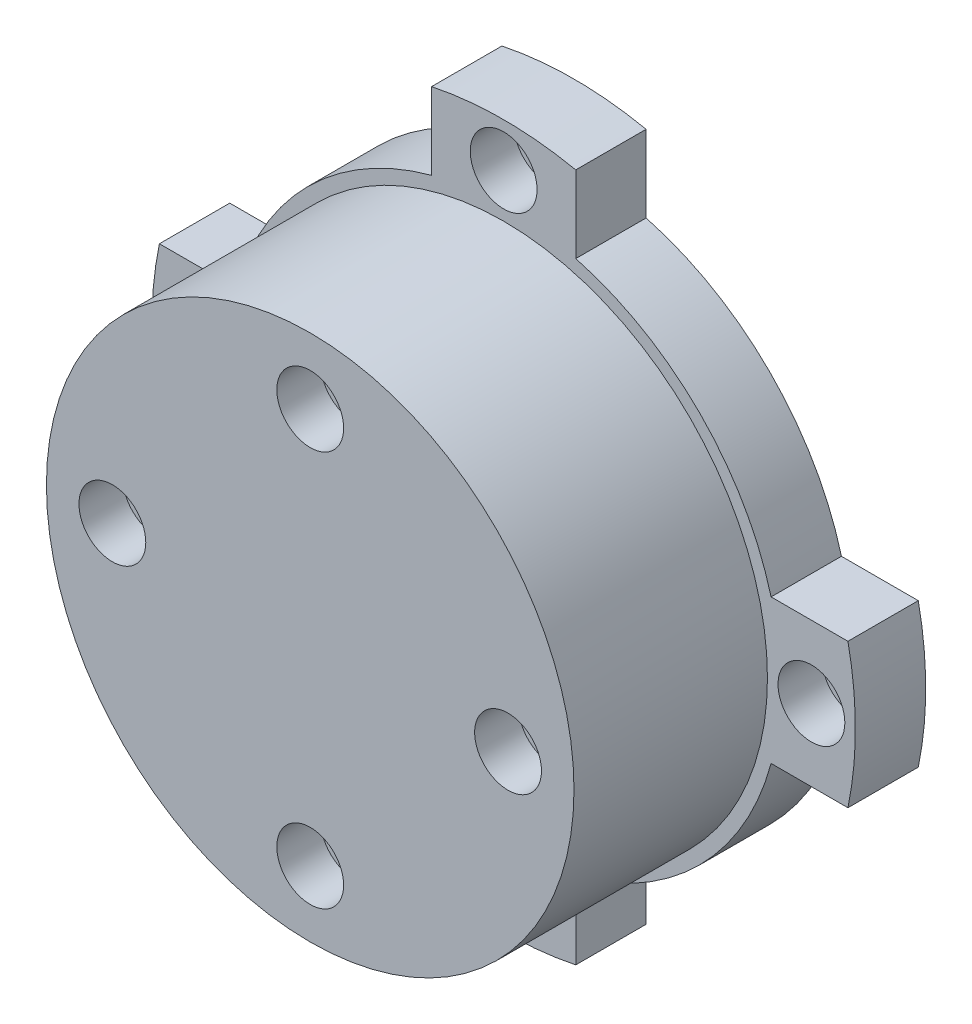
ISO-10303-21;
HEADER;
FILE_DESCRIPTION(('STEP AP214'),'2;1');
FILE_NAME('part.step','',(''),(''),'','','');
FILE_SCHEMA(('AUTOMOTIVE_DESIGN { 1 0 10303 214 1 1 1 1 }'));
ENDSEC;
DATA;
#1=APPLICATION_CONTEXT('core data for automotive mechanical design processes');
#2=APPLICATION_PROTOCOL_DEFINITION('international standard','automotive_design',2000,#1);
#3=PRODUCT_CONTEXT('',#1,'mechanical');
#4=PRODUCT('Part','Part','',(#3));
#5=PRODUCT_RELATED_PRODUCT_CATEGORY('part','',(#4));
#6=PRODUCT_DEFINITION_FORMATION('','',#4);
#7=PRODUCT_DEFINITION_CONTEXT('part definition',#1,'design');
#8=PRODUCT_DEFINITION('design','',#6,#7);
#9=PRODUCT_DEFINITION_SHAPE('','',#8);
#10=(LENGTH_UNIT() NAMED_UNIT(*) SI_UNIT(.MILLI.,.METRE.));
#11=(NAMED_UNIT(*) PLANE_ANGLE_UNIT() SI_UNIT($,.RADIAN.));
#12=(NAMED_UNIT(*) SI_UNIT($,.STERADIAN.) SOLID_ANGLE_UNIT());
#13=UNCERTAINTY_MEASURE_WITH_UNIT(LENGTH_MEASURE(1.E-05),#10,'distance_accuracy_value','');
#14=(GEOMETRIC_REPRESENTATION_CONTEXT(3) GLOBAL_UNCERTAINTY_ASSIGNED_CONTEXT((#13)) GLOBAL_UNIT_ASSIGNED_CONTEXT((#10,
#11,#12)) REPRESENTATION_CONTEXT('',''));
#15=CARTESIAN_POINT('',(0.,0.,0.));
#16=DIRECTION('',(0.,0.,1.));
#17=DIRECTION('',(1.,0.,0.));
#18=AXIS2_PLACEMENT_3D('',#15,#16,#17);
#19=CARTESIAN_POINT('',(0.,0.,8.));
#20=DIRECTION('',(0.,0.,-1.));
#21=DIRECTION('',(-1.,0.,0.));
#22=AXIS2_PLACEMENT_3D('',#19,#20,#21);
#23=CYLINDRICAL_SURFACE('',#22,40.);
#24=CARTESIAN_POINT('',(0.,0.,0.));
#25=DIRECTION('',(0.,0.,1.));
#26=DIRECTION('',(1.,0.,0.));
#27=AXIS2_PLACEMENT_3D('',#24,#25,#26);
#28=CIRCLE('',#27,40.);
#29=CARTESIAN_POINT('',(8.2,39.1504789242737,0.));
#30=VERTEX_POINT('',#29);
#31=CARTESIAN_POINT('',(-8.2,39.1504789242737,0.));
#32=VERTEX_POINT('',#31);
#33=EDGE_CURVE('E179',#30,#32,#28,.T.);
#34=ORIENTED_EDGE('',*,*,#33,.T.);
#35=DIRECTION('',(0.,0.,-1.));
#36=VECTOR('',#35,1.);
#37=CARTESIAN_POINT('',(-8.2,39.1504789242737,8.));
#38=LINE('',#37,#36);
#39=CARTESIAN_POINT('',(-8.2,39.1504789242737,8.));
#40=VERTEX_POINT('',#39);
#41=EDGE_CURVE('E36',#40,#32,#38,.T.);
#42=ORIENTED_EDGE('',*,*,#41,.F.);
#43=CARTESIAN_POINT('',(0.,0.,8.));
#44=DIRECTION('',(0.,0.,1.));
#45=DIRECTION('',(1.,0.,0.));
#46=AXIS2_PLACEMENT_3D('',#43,#44,#45);
#47=CIRCLE('',#46,40.);
#48=CARTESIAN_POINT('',(8.2,39.1504789242737,8.));
#49=VERTEX_POINT('',#48);
#50=EDGE_CURVE('E210',#49,#40,#47,.T.);
#51=ORIENTED_EDGE('',*,*,#50,.F.);
#52=DIRECTION('',(0.,0.,-1.));
#53=VECTOR('',#52,1.);
#54=CARTESIAN_POINT('',(8.2,39.1504789242737,8.));
#55=LINE('',#54,#53);
#56=EDGE_CURVE('E175',#49,#30,#55,.T.);
#57=ORIENTED_EDGE('',*,*,#56,.T.);
#58=EDGE_LOOP('',(#34,#42,#51,#57));
#59=FACE_BOUND('',#58,.T.);
#60=ADVANCED_FACE('F33',(#59),#23,.T.);
#61=CARTESIAN_POINT('',(-8.2,39.1504789242737,8.));
#62=DIRECTION('',(1.,0.,0.));
#63=DIRECTION('',(0.,1.,0.));
#64=AXIS2_PLACEMENT_3D('',#61,#62,#63);
#65=PLANE('',#64);
#66=DIRECTION('',(0.,-1.,0.));
#67=VECTOR('',#66,1.);
#68=CARTESIAN_POINT('',(-8.2,39.1504789242737,0.));
#69=LINE('',#68,#67);
#70=CARTESIAN_POINT('',(-8.2,30.4139770500341,0.));
#71=VERTEX_POINT('',#70);
#72=EDGE_CURVE('E182',#32,#71,#69,.T.);
#73=ORIENTED_EDGE('',*,*,#72,.T.);
#74=DIRECTION('',(0.,0.,-1.));
#75=VECTOR('',#74,1.);
#76=CARTESIAN_POINT('',(-8.2,30.4139770500341,8.));
#77=LINE('',#76,#75);
#78=CARTESIAN_POINT('',(-8.2,30.4139770500341,8.));
#79=VERTEX_POINT('',#78);
#80=EDGE_CURVE('E243',#79,#71,#77,.T.);
#81=ORIENTED_EDGE('',*,*,#80,.F.);
#82=DIRECTION('',(0.,-1.,0.));
#83=VECTOR('',#82,1.);
#84=CARTESIAN_POINT('',(-8.2,39.1504789242737,8.));
#85=LINE('',#84,#83);
#86=EDGE_CURVE('E118',#40,#79,#85,.T.);
#87=ORIENTED_EDGE('',*,*,#86,.F.);
#88=ORIENTED_EDGE('',*,*,#41,.T.);
#89=EDGE_LOOP('',(#73,#81,#87,#88));
#90=FACE_BOUND('',#89,.T.);
#91=ADVANCED_FACE('F249',(#90),#65,.F.);
#92=CARTESIAN_POINT('',(0.,0.,8.));
#93=DIRECTION('',(0.,0.,-1.));
#94=DIRECTION('',(-1.,0.,0.));
#95=AXIS2_PLACEMENT_3D('',#92,#93,#94);
#96=CYLINDRICAL_SURFACE('',#95,31.5);
#97=CARTESIAN_POINT('',(0.,0.,0.));
#98=DIRECTION('',(0.,0.,1.));
#99=DIRECTION('',(1.,0.,0.));
#100=AXIS2_PLACEMENT_3D('',#97,#98,#99);
#101=CIRCLE('',#100,31.5);
#102=CARTESIAN_POINT('',(-30.413977050034,8.2000000000003,0.));
#103=VERTEX_POINT('',#102);
#104=EDGE_CURVE('E185',#71,#103,#101,.T.);
#105=ORIENTED_EDGE('',*,*,#104,.T.);
#106=DIRECTION('',(0.,0.,-1.));
#107=VECTOR('',#106,1.);
#108=CARTESIAN_POINT('',(-30.413977050034,8.2000000000003,8.));
#109=LINE('',#108,#107);
#110=CARTESIAN_POINT('',(-30.413977050034,8.2000000000003,8.));
#111=VERTEX_POINT('',#110);
#112=EDGE_CURVE('E241',#111,#103,#109,.T.);
#113=ORIENTED_EDGE('',*,*,#112,.F.);
#114=CARTESIAN_POINT('',(0.,0.,8.));
#115=DIRECTION('',(0.,0.,1.));
#116=DIRECTION('',(1.,0.,0.));
#117=AXIS2_PLACEMENT_3D('',#114,#115,#116);
#118=CIRCLE('',#117,31.5);
#119=EDGE_CURVE('E266',#79,#111,#118,.T.);
#120=ORIENTED_EDGE('',*,*,#119,.F.);
#121=ORIENTED_EDGE('',*,*,#80,.T.);
#122=EDGE_LOOP('',(#105,#113,#120,#121));
#123=FACE_BOUND('',#122,.T.);
#124=ADVANCED_FACE('F258',(#123),#96,.T.);
#125=CARTESIAN_POINT('',(-39.1504789242736,8.2000000000004,8.));
#126=DIRECTION('',(0.,-1.,0.));
#127=DIRECTION('',(1.,0.,0.));
#128=AXIS2_PLACEMENT_3D('',#125,#126,#127);
#129=PLANE('',#128);
#130=DIRECTION('',(-1.,0.,0.));
#131=VECTOR('',#130,1.);
#132=CARTESIAN_POINT('',(-39.1504789242736,8.2000000000004,0.));
#133=LINE('',#132,#131);
#134=CARTESIAN_POINT('',(-39.1504789242736,8.2000000000004,0.));
#135=VERTEX_POINT('',#134);
#136=EDGE_CURVE('E187',#103,#135,#133,.T.);
#137=ORIENTED_EDGE('',*,*,#136,.T.);
#138=DIRECTION('',(0.,0.,-1.));
#139=VECTOR('',#138,1.);
#140=CARTESIAN_POINT('',(-39.1504789242736,8.2000000000004,8.));
#141=LINE('',#140,#139);
#142=CARTESIAN_POINT('',(-39.1504789242736,8.2000000000004,8.));
#143=VERTEX_POINT('',#142);
#144=EDGE_CURVE('E238',#143,#135,#141,.T.);
#145=ORIENTED_EDGE('',*,*,#144,.F.);
#146=DIRECTION('',(-1.,0.,0.));
#147=VECTOR('',#146,1.);
#148=CARTESIAN_POINT('',(-39.1504789242736,8.2000000000004,8.));
#149=LINE('',#148,#147);
#150=EDGE_CURVE('E263',#111,#143,#149,.T.);
#151=ORIENTED_EDGE('',*,*,#150,.F.);
#152=ORIENTED_EDGE('',*,*,#112,.T.);
#153=EDGE_LOOP('',(#137,#145,#151,#152));
#154=FACE_BOUND('',#153,.T.);
#155=ADVANCED_FACE('F261',(#154),#129,.F.);
#156=CARTESIAN_POINT('',(0.,0.,8.));
#157=DIRECTION('',(0.,0.,-1.));
#158=DIRECTION('',(-1.,0.,0.));
#159=AXIS2_PLACEMENT_3D('',#156,#157,#158);
#160=CYLINDRICAL_SURFACE('',#159,40.);
#161=CARTESIAN_POINT('',(0.,0.,0.));
#162=DIRECTION('',(0.,0.,1.));
#163=DIRECTION('',(1.,0.,0.));
#164=AXIS2_PLACEMENT_3D('',#161,#162,#163);
#165=CIRCLE('',#164,40.);
#166=CARTESIAN_POINT('',(-39.1504789242738,-8.19999999999959,0.));
#167=VERTEX_POINT('',#166);
#168=EDGE_CURVE('E189',#135,#167,#165,.T.);
#169=ORIENTED_EDGE('',*,*,#168,.T.);
#170=DIRECTION('',(0.,0.,-1.));
#171=VECTOR('',#170,1.);
#172=CARTESIAN_POINT('',(-39.1504789242738,-8.19999999999959,8.));
#173=LINE('',#172,#171);
#174=CARTESIAN_POINT('',(-39.1504789242738,-8.19999999999959,8.));
#175=VERTEX_POINT('',#174);
#176=EDGE_CURVE('E235',#175,#167,#173,.T.);
#177=ORIENTED_EDGE('',*,*,#176,.F.);
#178=CARTESIAN_POINT('',(0.,0.,8.));
#179=DIRECTION('',(0.,0.,1.));
#180=DIRECTION('',(1.,0.,0.));
#181=AXIS2_PLACEMENT_3D('',#178,#179,#180);
#182=CIRCLE('',#181,40.);
#183=EDGE_CURVE('E265',#143,#175,#182,.T.);
#184=ORIENTED_EDGE('',*,*,#183,.F.);
#185=ORIENTED_EDGE('',*,*,#144,.T.);
#186=EDGE_LOOP('',(#169,#177,#184,#185));
#187=FACE_BOUND('',#186,.T.);
#188=ADVANCED_FACE('F325',(#187),#160,.T.);
#189=CARTESIAN_POINT('',(-39.1504789242738,-8.19999999999959,8.));
#190=DIRECTION('',(0.,1.,0.));
#191=DIRECTION('',(-1.,0.,0.));
#192=AXIS2_PLACEMENT_3D('',#189,#190,#191);
#193=PLANE('',#192);
#194=DIRECTION('',(1.,0.,0.));
#195=VECTOR('',#194,1.);
#196=CARTESIAN_POINT('',(-39.1504789242738,-8.19999999999959,0.));
#197=LINE('',#196,#195);
#198=CARTESIAN_POINT('',(-30.4139770500342,-8.19999999999968,0.));
#199=VERTEX_POINT('',#198);
#200=EDGE_CURVE('E191',#167,#199,#197,.T.);
#201=ORIENTED_EDGE('',*,*,#200,.T.);
#202=DIRECTION('',(0.,0.,-1.));
#203=VECTOR('',#202,1.);
#204=CARTESIAN_POINT('',(-30.4139770500342,-8.19999999999968,8.));
#205=LINE('',#204,#203);
#206=CARTESIAN_POINT('',(-30.4139770500342,-8.19999999999968,8.));
#207=VERTEX_POINT('',#206);
#208=EDGE_CURVE('E232',#207,#199,#205,.T.);
#209=ORIENTED_EDGE('',*,*,#208,.F.);
#210=DIRECTION('',(1.,0.,0.));
#211=VECTOR('',#210,1.);
#212=CARTESIAN_POINT('',(-39.1504789242738,-8.19999999999959,8.));
#213=LINE('',#212,#211);
#214=EDGE_CURVE('E268',#175,#207,#213,.T.);
#215=ORIENTED_EDGE('',*,*,#214,.F.);
#216=ORIENTED_EDGE('',*,*,#176,.T.);
#217=EDGE_LOOP('',(#201,#209,#215,#216));
#218=FACE_BOUND('',#217,.T.);
#219=ADVANCED_FACE('F322',(#218),#193,.F.);
#220=CARTESIAN_POINT('',(0.,0.,8.));
#221=DIRECTION('',(0.,0.,-1.));
#222=DIRECTION('',(-1.,0.,0.));
#223=AXIS2_PLACEMENT_3D('',#220,#221,#222);
#224=CYLINDRICAL_SURFACE('',#223,31.5);
#225=CARTESIAN_POINT('',(0.,0.,0.));
#226=DIRECTION('',(0.,0.,1.));
#227=DIRECTION('',(1.,0.,0.));
#228=AXIS2_PLACEMENT_3D('',#225,#226,#227);
#229=CIRCLE('',#228,31.5);
#230=CARTESIAN_POINT('',(-8.20000000000021,-30.413977050034,0.));
#231=VERTEX_POINT('',#230);
#232=EDGE_CURVE('E193',#199,#231,#229,.T.);
#233=ORIENTED_EDGE('',*,*,#232,.T.);
#234=DIRECTION('',(0.,0.,-1.));
#235=VECTOR('',#234,1.);
#236=CARTESIAN_POINT('',(-8.20000000000021,-30.413977050034,8.));
#237=LINE('',#236,#235);
#238=CARTESIAN_POINT('',(-8.20000000000021,-30.413977050034,8.));
#239=VERTEX_POINT('',#238);
#240=EDGE_CURVE('E229',#239,#231,#237,.T.);
#241=ORIENTED_EDGE('',*,*,#240,.F.);
#242=CARTESIAN_POINT('',(0.,0.,8.));
#243=DIRECTION('',(0.,0.,1.));
#244=DIRECTION('',(1.,0.,0.));
#245=AXIS2_PLACEMENT_3D('',#242,#243,#244);
#246=CIRCLE('',#245,31.5);
#247=EDGE_CURVE('E274',#207,#239,#246,.T.);
#248=ORIENTED_EDGE('',*,*,#247,.F.);
#249=ORIENTED_EDGE('',*,*,#208,.T.);
#250=EDGE_LOOP('',(#233,#241,#248,#249));
#251=FACE_BOUND('',#250,.T.);
#252=ADVANCED_FACE('F318',(#251),#224,.T.);
#253=CARTESIAN_POINT('',(-8.20000000000027,-39.1504789242737,8.));
#254=DIRECTION('',(1.,0.,0.));
#255=DIRECTION('',(0.,1.,0.));
#256=AXIS2_PLACEMENT_3D('',#253,#254,#255);
#257=PLANE('',#256);
#258=DIRECTION('',(0.,-1.,0.));
#259=VECTOR('',#258,1.);
#260=CARTESIAN_POINT('',(-8.20000000000027,-39.1504789242737,0.));
#261=LINE('',#260,#259);
#262=CARTESIAN_POINT('',(-8.20000000000027,-39.1504789242737,0.));
#263=VERTEX_POINT('',#262);
#264=EDGE_CURVE('E195',#231,#263,#261,.T.);
#265=ORIENTED_EDGE('',*,*,#264,.T.);
#266=DIRECTION('',(0.,0.,-1.));
#267=VECTOR('',#266,1.);
#268=CARTESIAN_POINT('',(-8.20000000000027,-39.1504789242737,8.));
#269=LINE('',#268,#267);
#270=CARTESIAN_POINT('',(-8.20000000000027,-39.1504789242737,8.));
#271=VERTEX_POINT('',#270);
#272=EDGE_CURVE('E226',#271,#263,#269,.T.);
#273=ORIENTED_EDGE('',*,*,#272,.F.);
#274=DIRECTION('',(0.,-1.,0.));
#275=VECTOR('',#274,1.);
#276=CARTESIAN_POINT('',(-8.20000000000027,-39.1504789242737,8.));
#277=LINE('',#276,#275);
#278=EDGE_CURVE('E276',#239,#271,#277,.T.);
#279=ORIENTED_EDGE('',*,*,#278,.F.);
#280=ORIENTED_EDGE('',*,*,#240,.T.);
#281=EDGE_LOOP('',(#265,#273,#279,#280));
#282=FACE_BOUND('',#281,.T.);
#283=ADVANCED_FACE('F313',(#282),#257,.F.);
#284=CARTESIAN_POINT('',(0.,0.,8.));
#285=DIRECTION('',(0.,0.,-1.));
#286=DIRECTION('',(-1.,0.,0.));
#287=AXIS2_PLACEMENT_3D('',#284,#285,#286);
#288=CYLINDRICAL_SURFACE('',#287,40.);
#289=CARTESIAN_POINT('',(0.,0.,0.));
#290=DIRECTION('',(0.,0.,1.));
#291=DIRECTION('',(1.,0.,0.));
#292=AXIS2_PLACEMENT_3D('',#289,#290,#291);
#293=CIRCLE('',#292,40.);
#294=CARTESIAN_POINT('',(8.19999999999971,-39.1504789242738,0.));
#295=VERTEX_POINT('',#294);
#296=EDGE_CURVE('E197',#263,#295,#293,.T.);
#297=ORIENTED_EDGE('',*,*,#296,.T.);
#298=DIRECTION('',(0.,0.,-1.));
#299=VECTOR('',#298,1.);
#300=CARTESIAN_POINT('',(8.19999999999971,-39.1504789242738,8.));
#301=LINE('',#300,#299);
#302=CARTESIAN_POINT('',(8.19999999999971,-39.1504789242738,8.));
#303=VERTEX_POINT('',#302);
#304=EDGE_CURVE('E223',#303,#295,#301,.T.);
#305=ORIENTED_EDGE('',*,*,#304,.F.);
#306=CARTESIAN_POINT('',(0.,0.,8.));
#307=DIRECTION('',(0.,0.,1.));
#308=DIRECTION('',(1.,0.,0.));
#309=AXIS2_PLACEMENT_3D('',#306,#307,#308);
#310=CIRCLE('',#309,40.);
#311=EDGE_CURVE('E278',#271,#303,#310,.T.);
#312=ORIENTED_EDGE('',*,*,#311,.F.);
#313=ORIENTED_EDGE('',*,*,#272,.T.);
#314=EDGE_LOOP('',(#297,#305,#312,#313));
#315=FACE_BOUND('',#314,.T.);
#316=ADVANCED_FACE('F307',(#315),#288,.T.);
#317=CARTESIAN_POINT('',(8.19999999999972,-39.1504789242738,8.));
#318=DIRECTION('',(-1.,0.,0.));
#319=DIRECTION('',(0.,-1.,0.));
#320=AXIS2_PLACEMENT_3D('',#317,#318,#319);
#321=PLANE('',#320);
#322=DIRECTION('',(0.,1.,0.));
#323=VECTOR('',#322,1.);
#324=CARTESIAN_POINT('',(8.19999999999972,-39.1504789242738,0.));
#325=LINE('',#324,#323);
#326=CARTESIAN_POINT('',(8.19999999999978,-30.4139770500342,0.));
#327=VERTEX_POINT('',#326);
#328=EDGE_CURVE('E199',#295,#327,#325,.T.);
#329=ORIENTED_EDGE('',*,*,#328,.T.);
#330=DIRECTION('',(0.,0.,-1.));
#331=VECTOR('',#330,1.);
#332=CARTESIAN_POINT('',(8.19999999999978,-30.4139770500342,8.));
#333=LINE('',#332,#331);
#334=CARTESIAN_POINT('',(8.19999999999978,-30.4139770500342,8.));
#335=VERTEX_POINT('',#334);
#336=EDGE_CURVE('E220',#335,#327,#333,.T.);
#337=ORIENTED_EDGE('',*,*,#336,.F.);
#338=DIRECTION('',(0.,1.,0.));
#339=VECTOR('',#338,1.);
#340=CARTESIAN_POINT('',(8.19999999999972,-39.1504789242738,8.));
#341=LINE('',#340,#339);
#342=EDGE_CURVE('E280',#303,#335,#341,.T.);
#343=ORIENTED_EDGE('',*,*,#342,.F.);
#344=ORIENTED_EDGE('',*,*,#304,.T.);
#345=EDGE_LOOP('',(#329,#337,#343,#344));
#346=FACE_BOUND('',#345,.T.);
#347=ADVANCED_FACE('F303',(#346),#321,.F.);
#348=CARTESIAN_POINT('',(0.,0.,8.));
#349=DIRECTION('',(0.,0.,-1.));
#350=DIRECTION('',(-1.,0.,0.));
#351=AXIS2_PLACEMENT_3D('',#348,#349,#350);
#352=CYLINDRICAL_SURFACE('',#351,31.5);
#353=CARTESIAN_POINT('',(0.,0.,0.));
#354=DIRECTION('',(0.,0.,1.));
#355=DIRECTION('',(1.,0.,0.));
#356=AXIS2_PLACEMENT_3D('',#353,#354,#355);
#357=CIRCLE('',#356,31.5);
#358=CARTESIAN_POINT('',(30.4139770500341,-8.2000000000001,0.));
#359=VERTEX_POINT('',#358);
#360=EDGE_CURVE('E201',#327,#359,#357,.T.);
#361=ORIENTED_EDGE('',*,*,#360,.T.);
#362=DIRECTION('',(0.,0.,-1.));
#363=VECTOR('',#362,1.);
#364=CARTESIAN_POINT('',(30.4139770500341,-8.2000000000001,8.));
#365=LINE('',#364,#363);
#366=CARTESIAN_POINT('',(30.4139770500341,-8.2000000000001,8.));
#367=VERTEX_POINT('',#366);
#368=EDGE_CURVE('E217',#367,#359,#365,.T.);
#369=ORIENTED_EDGE('',*,*,#368,.F.);
#370=CARTESIAN_POINT('',(0.,0.,8.));
#371=DIRECTION('',(0.,0.,1.));
#372=DIRECTION('',(1.,0.,0.));
#373=AXIS2_PLACEMENT_3D('',#370,#371,#372);
#374=CIRCLE('',#373,31.5);
#375=EDGE_CURVE('E282',#335,#367,#374,.T.);
#376=ORIENTED_EDGE('',*,*,#375,.F.);
#377=ORIENTED_EDGE('',*,*,#336,.T.);
#378=EDGE_LOOP('',(#361,#369,#376,#377));
#379=FACE_BOUND('',#378,.T.);
#380=ADVANCED_FACE('F299',(#379),#352,.T.);
#381=CARTESIAN_POINT('',(39.1504789242737,-8.20000000000013,8.));
#382=DIRECTION('',(0.,1.,0.));
#383=DIRECTION('',(-1.,0.,0.));
#384=AXIS2_PLACEMENT_3D('',#381,#382,#383);
#385=PLANE('',#384);
#386=DIRECTION('',(1.,0.,0.));
#387=VECTOR('',#386,1.);
#388=CARTESIAN_POINT('',(39.1504789242737,-8.20000000000013,0.));
#389=LINE('',#388,#387);
#390=CARTESIAN_POINT('',(39.1504789242737,-8.20000000000013,0.));
#391=VERTEX_POINT('',#390);
#392=EDGE_CURVE('E203',#359,#391,#389,.T.);
#393=ORIENTED_EDGE('',*,*,#392,.T.);
#394=DIRECTION('',(0.,0.,-1.));
#395=VECTOR('',#394,1.);
#396=CARTESIAN_POINT('',(39.1504789242737,-8.20000000000013,8.));
#397=LINE('',#396,#395);
#398=CARTESIAN_POINT('',(39.1504789242737,-8.20000000000013,8.));
#399=VERTEX_POINT('',#398);
#400=EDGE_CURVE('E214',#399,#391,#397,.T.);
#401=ORIENTED_EDGE('',*,*,#400,.F.);
#402=DIRECTION('',(1.,0.,0.));
#403=VECTOR('',#402,1.);
#404=CARTESIAN_POINT('',(39.1504789242737,-8.20000000000013,8.));
#405=LINE('',#404,#403);
#406=EDGE_CURVE('E284',#367,#399,#405,.T.);
#407=ORIENTED_EDGE('',*,*,#406,.F.);
#408=ORIENTED_EDGE('',*,*,#368,.T.);
#409=EDGE_LOOP('',(#393,#401,#407,#408));
#410=FACE_BOUND('',#409,.T.);
#411=ADVANCED_FACE('F290',(#410),#385,.F.);
#412=CARTESIAN_POINT('',(0.,0.,8.));
#413=DIRECTION('',(0.,0.,-1.));
#414=DIRECTION('',(-1.,0.,0.));
#415=AXIS2_PLACEMENT_3D('',#412,#413,#414);
#416=CYLINDRICAL_SURFACE('',#415,40.);
#417=CARTESIAN_POINT('',(0.,0.,0.));
#418=DIRECTION('',(0.,0.,1.));
#419=DIRECTION('',(1.,0.,0.));
#420=AXIS2_PLACEMENT_3D('',#417,#418,#419);
#421=CIRCLE('',#420,40.);
#422=CARTESIAN_POINT('',(39.1504789242737,8.19999999999986,0.));
#423=VERTEX_POINT('',#422);
#424=EDGE_CURVE('E205',#391,#423,#421,.T.);
#425=ORIENTED_EDGE('',*,*,#424,.T.);
#426=DIRECTION('',(0.,0.,-1.));
#427=VECTOR('',#426,1.);
#428=CARTESIAN_POINT('',(39.1504789242737,8.19999999999986,8.));
#429=LINE('',#428,#427);
#430=CARTESIAN_POINT('',(39.1504789242737,8.19999999999986,8.));
#431=VERTEX_POINT('',#430);
#432=EDGE_CURVE('E170',#431,#423,#429,.T.);
#433=ORIENTED_EDGE('',*,*,#432,.F.);
#434=CARTESIAN_POINT('',(0.,0.,8.));
#435=DIRECTION('',(0.,0.,1.));
#436=DIRECTION('',(1.,0.,0.));
#437=AXIS2_PLACEMENT_3D('',#434,#435,#436);
#438=CIRCLE('',#437,40.);
#439=EDGE_CURVE('E161',#399,#431,#438,.T.);
#440=ORIENTED_EDGE('',*,*,#439,.F.);
#441=ORIENTED_EDGE('',*,*,#400,.T.);
#442=EDGE_LOOP('',(#425,#433,#440,#441));
#443=FACE_BOUND('',#442,.T.);
#444=ADVANCED_FACE('F294',(#443),#416,.T.);
#445=CARTESIAN_POINT('',(39.1504789242737,8.19999999999986,8.));
#446=DIRECTION('',(0.,-1.,0.));
#447=DIRECTION('',(1.,0.,0.));
#448=AXIS2_PLACEMENT_3D('',#445,#446,#447);
#449=PLANE('',#448);
#450=DIRECTION('',(-1.,0.,0.));
#451=VECTOR('',#450,1.);
#452=CARTESIAN_POINT('',(39.1504789242737,8.19999999999986,0.));
#453=LINE('',#452,#451);
#454=CARTESIAN_POINT('',(30.4139770500341,8.19999999999989,0.));
#455=VERTEX_POINT('',#454);
#456=EDGE_CURVE('E169',#423,#455,#453,.T.);
#457=ORIENTED_EDGE('',*,*,#456,.T.);
#458=DIRECTION('',(0.,0.,-1.));
#459=VECTOR('',#458,1.);
#460=CARTESIAN_POINT('',(30.4139770500341,8.19999999999989,8.));
#461=LINE('',#460,#459);
#462=CARTESIAN_POINT('',(30.4139770500341,8.19999999999989,8.));
#463=VERTEX_POINT('',#462);
#464=EDGE_CURVE('E166',#463,#455,#461,.T.);
#465=ORIENTED_EDGE('',*,*,#464,.F.);
#466=DIRECTION('',(-1.,0.,0.));
#467=VECTOR('',#466,1.);
#468=CARTESIAN_POINT('',(39.1504789242737,8.19999999999986,8.));
#469=LINE('',#468,#467);
#470=EDGE_CURVE('E155',#431,#463,#469,.T.);
#471=ORIENTED_EDGE('',*,*,#470,.F.);
#472=ORIENTED_EDGE('',*,*,#432,.T.);
#473=EDGE_LOOP('',(#457,#465,#471,#472));
#474=FACE_BOUND('',#473,.T.);
#475=ADVANCED_FACE('F167',(#474),#449,.F.);
#476=CARTESIAN_POINT('',(0.,0.,8.));
#477=DIRECTION('',(0.,0.,-1.));
#478=DIRECTION('',(-1.,0.,0.));
#479=AXIS2_PLACEMENT_3D('',#476,#477,#478);
#480=CYLINDRICAL_SURFACE('',#479,31.5);
#481=CARTESIAN_POINT('',(0.,0.,0.));
#482=DIRECTION('',(0.,0.,1.));
#483=DIRECTION('',(1.,0.,0.));
#484=AXIS2_PLACEMENT_3D('',#481,#482,#483);
#485=CIRCLE('',#484,31.5);
#486=CARTESIAN_POINT('',(8.2,30.4139770500341,0.));
#487=VERTEX_POINT('',#486);
#488=EDGE_CURVE('E103',#455,#487,#485,.T.);
#489=ORIENTED_EDGE('',*,*,#488,.T.);
#490=DIRECTION('',(0.,0.,-1.));
#491=VECTOR('',#490,1.);
#492=CARTESIAN_POINT('',(8.2,30.4139770500341,8.));
#493=LINE('',#492,#491);
#494=CARTESIAN_POINT('',(8.2,30.4139770500341,8.));
#495=VERTEX_POINT('',#494);
#496=EDGE_CURVE('E171',#495,#487,#493,.T.);
#497=ORIENTED_EDGE('',*,*,#496,.F.);
#498=CARTESIAN_POINT('',(0.,0.,8.));
#499=DIRECTION('',(0.,0.,1.));
#500=DIRECTION('',(1.,0.,0.));
#501=AXIS2_PLACEMENT_3D('',#498,#499,#500);
#502=CIRCLE('',#501,31.5);
#503=EDGE_CURVE('E159',#463,#495,#502,.T.);
#504=ORIENTED_EDGE('',*,*,#503,.F.);
#505=ORIENTED_EDGE('',*,*,#464,.T.);
#506=EDGE_LOOP('',(#489,#497,#504,#505));
#507=FACE_BOUND('',#506,.T.);
#508=ADVANCED_FACE('F173',(#507),#480,.T.);
#509=CARTESIAN_POINT('',(8.2,39.1504789242737,8.));
#510=DIRECTION('',(-1.,0.,0.));
#511=DIRECTION('',(0.,-1.,0.));
#512=AXIS2_PLACEMENT_3D('',#509,#510,#511);
#513=PLANE('',#512);
#514=DIRECTION('',(0.,1.,0.));
#515=VECTOR('',#514,1.);
#516=CARTESIAN_POINT('',(8.2,39.1504789242737,0.));
#517=LINE('',#516,#515);
#518=EDGE_CURVE('E109',#487,#30,#517,.T.);
#519=ORIENTED_EDGE('',*,*,#518,.T.);
#520=ORIENTED_EDGE('',*,*,#56,.F.);
#521=DIRECTION('',(0.,1.,0.));
#522=VECTOR('',#521,1.);
#523=CARTESIAN_POINT('',(8.2,39.1504789242737,8.));
#524=LINE('',#523,#522);
#525=EDGE_CURVE('E50',#495,#49,#524,.T.);
#526=ORIENTED_EDGE('',*,*,#525,.F.);
#527=ORIENTED_EDGE('',*,*,#496,.T.);
#528=EDGE_LOOP('',(#519,#520,#526,#527));
#529=FACE_BOUND('',#528,.T.);
#530=ADVANCED_FACE('F431',(#529),#513,.F.);
#531=CARTESIAN_POINT('',(0.,0.,8.));
#532=DIRECTION('',(0.,0.,1.));
#533=DIRECTION('',(1.,0.,0.));
#534=AXIS2_PLACEMENT_3D('',#531,#532,#533);
#535=PLANE('',#534);
#536=CARTESIAN_POINT('',(0.,35.,8.));
#537=DIRECTION('',(0.,0.,1.));
#538=DIRECTION('',(1.,0.,0.));
#539=AXIS2_PLACEMENT_3D('',#536,#537,#538);
#540=CIRCLE('',#539,3.8);
#541=CARTESIAN_POINT('',(3.8,35.,8.));
#542=VERTEX_POINT('',#541);
#543=EDGE_CURVE('E671',#542,#542,#540,.T.);
#544=ORIENTED_EDGE('',*,*,#543,.F.);
#545=EDGE_LOOP('',(#544));
#546=FACE_BOUND('',#545,.T.);
#547=CARTESIAN_POINT('',(35.,0.,8.));
#548=DIRECTION('',(0.,0.,1.));
#549=DIRECTION('',(1.,0.,0.));
#550=AXIS2_PLACEMENT_3D('',#547,#548,#549);
#551=CIRCLE('',#550,3.80000000000011);
#552=CARTESIAN_POINT('',(38.8000000000001,0.,8.));
#553=VERTEX_POINT('',#552);
#554=EDGE_CURVE('E677',#553,#553,#551,.T.);
#555=ORIENTED_EDGE('',*,*,#554,.F.);
#556=EDGE_LOOP('',(#555));
#557=FACE_BOUND('',#556,.T.);
#558=CARTESIAN_POINT('',(0.,-35.,8.));
#559=DIRECTION('',(0.,0.,1.));
#560=DIRECTION('',(1.,0.,0.));
#561=AXIS2_PLACEMENT_3D('',#558,#559,#560);
#562=CIRCLE('',#561,3.80000000000023);
#563=CARTESIAN_POINT('',(3.80000000000022,-35.,8.));
#564=VERTEX_POINT('',#563);
#565=EDGE_CURVE('E683',#564,#564,#562,.T.);
#566=ORIENTED_EDGE('',*,*,#565,.F.);
#567=EDGE_LOOP('',(#566));
#568=FACE_BOUND('',#567,.T.);
#569=CARTESIAN_POINT('',(-35.,0.,8.));
#570=DIRECTION('',(0.,0.,1.));
#571=DIRECTION('',(1.,0.,0.));
#572=AXIS2_PLACEMENT_3D('',#569,#570,#571);
#573=CIRCLE('',#572,3.80000000000035);
#574=CARTESIAN_POINT('',(-31.1999999999997,0.,8.));
#575=VERTEX_POINT('',#574);
#576=EDGE_CURVE('E641',#575,#575,#573,.T.);
#577=ORIENTED_EDGE('',*,*,#576,.F.);
#578=EDGE_LOOP('',(#577));
#579=FACE_BOUND('',#578,.T.);
#580=CARTESIAN_POINT('',(0.,0.,8.));
#581=DIRECTION('',(0.,0.,1.));
#582=DIRECTION('',(1.,0.,0.));
#583=AXIS2_PLACEMENT_3D('',#580,#581,#582);
#584=CIRCLE('',#583,30.);
#585=CARTESIAN_POINT('',(30.,0.,8.));
#586=VERTEX_POINT('',#585);
#587=EDGE_CURVE('E11',#586,#586,#584,.T.);
#588=ORIENTED_EDGE('',*,*,#587,.F.);
#589=EDGE_LOOP('',(#588));
#590=FACE_BOUND('',#589,.T.);
#591=ORIENTED_EDGE('',*,*,#50,.T.);
#592=ORIENTED_EDGE('',*,*,#86,.T.);
#593=ORIENTED_EDGE('',*,*,#119,.T.);
#594=ORIENTED_EDGE('',*,*,#150,.T.);
#595=ORIENTED_EDGE('',*,*,#183,.T.);
#596=ORIENTED_EDGE('',*,*,#214,.T.);
#597=ORIENTED_EDGE('',*,*,#247,.T.);
#598=ORIENTED_EDGE('',*,*,#278,.T.);
#599=ORIENTED_EDGE('',*,*,#311,.T.);
#600=ORIENTED_EDGE('',*,*,#342,.T.);
#601=ORIENTED_EDGE('',*,*,#375,.T.);
#602=ORIENTED_EDGE('',*,*,#406,.T.);
#603=ORIENTED_EDGE('',*,*,#439,.T.);
#604=ORIENTED_EDGE('',*,*,#470,.T.);
#605=ORIENTED_EDGE('',*,*,#503,.T.);
#606=ORIENTED_EDGE('',*,*,#525,.T.);
#607=EDGE_LOOP('',(#591,#592,#593,#594,#595,#596,#597,#598,#599,#600,#601,#602,#603,#604,#605,#606));
#608=FACE_BOUND('',#607,.T.);
#609=ADVANCED_FACE('F157',(#546,#557,#568,#579,#590,#608),#535,.T.);
#610=CARTESIAN_POINT('',(0.,0.,0.));
#611=DIRECTION('',(0.,0.,1.));
#612=DIRECTION('',(1.,0.,0.));
#613=AXIS2_PLACEMENT_3D('',#610,#611,#612);
#614=PLANE('',#613);
#615=ORIENTED_EDGE('',*,*,#33,.F.);
#616=ORIENTED_EDGE('',*,*,#518,.F.);
#617=ORIENTED_EDGE('',*,*,#488,.F.);
#618=ORIENTED_EDGE('',*,*,#456,.F.);
#619=ORIENTED_EDGE('',*,*,#424,.F.);
#620=ORIENTED_EDGE('',*,*,#392,.F.);
#621=ORIENTED_EDGE('',*,*,#360,.F.);
#622=ORIENTED_EDGE('',*,*,#328,.F.);
#623=ORIENTED_EDGE('',*,*,#296,.F.);
#624=ORIENTED_EDGE('',*,*,#264,.F.);
#625=ORIENTED_EDGE('',*,*,#232,.F.);
#626=ORIENTED_EDGE('',*,*,#200,.F.);
#627=ORIENTED_EDGE('',*,*,#168,.F.);
#628=ORIENTED_EDGE('',*,*,#136,.F.);
#629=ORIENTED_EDGE('',*,*,#104,.F.);
#630=ORIENTED_EDGE('',*,*,#72,.F.);
#631=EDGE_LOOP('',(#615,#616,#617,#618,#619,#620,#621,#622,#623,#624,#625,#626,#627,#628,#629,#630));
#632=FACE_BOUND('',#631,.T.);
#633=ADVANCED_FACE('F254',(#632),#614,.F.);
#634=CARTESIAN_POINT('',(0.,0.,30.));
#635=DIRECTION('',(0.,0.,-1.));
#636=DIRECTION('',(-1.,0.,0.));
#637=AXIS2_PLACEMENT_3D('',#634,#635,#636);
#638=CYLINDRICAL_SURFACE('',#637,30.);
#639=CARTESIAN_POINT('',(0.,0.,30.));
#640=DIRECTION('',(0.,0.,1.));
#641=DIRECTION('',(1.,0.,0.));
#642=AXIS2_PLACEMENT_3D('',#639,#640,#641);
#643=CIRCLE('',#642,30.);
#644=CARTESIAN_POINT('',(30.,0.,30.));
#645=VERTEX_POINT('',#644);
#646=EDGE_CURVE('E183',#645,#645,#643,.T.);
#647=ORIENTED_EDGE('',*,*,#646,.F.);
#648=EDGE_LOOP('',(#647));
#649=FACE_BOUND('',#648,.T.);
#650=ORIENTED_EDGE('',*,*,#587,.T.);
#651=EDGE_LOOP('',(#650));
#652=FACE_BOUND('',#651,.T.);
#653=ADVANCED_FACE('F450',(#649,#652),#638,.T.);
#654=CARTESIAN_POINT('',(0.,0.,30.));
#655=DIRECTION('',(0.,0.,1.));
#656=DIRECTION('',(1.,0.,0.));
#657=AXIS2_PLACEMENT_3D('',#654,#655,#656);
#658=PLANE('',#657);
#659=CARTESIAN_POINT('',(0.,22.5,30.));
#660=DIRECTION('',(0.,0.,1.));
#661=DIRECTION('',(1.,0.,0.));
#662=AXIS2_PLACEMENT_3D('',#659,#660,#661);
#663=CIRCLE('',#662,3.8);
#664=CARTESIAN_POINT('',(3.8,22.5,30.));
#665=VERTEX_POINT('',#664);
#666=EDGE_CURVE('E642',#665,#665,#663,.T.);
#667=ORIENTED_EDGE('',*,*,#666,.F.);
#668=EDGE_LOOP('',(#667));
#669=FACE_BOUND('',#668,.T.);
#670=CARTESIAN_POINT('',(22.5,0.,30.));
#671=DIRECTION('',(0.,0.,1.));
#672=DIRECTION('',(1.,0.,0.));
#673=AXIS2_PLACEMENT_3D('',#670,#671,#672);
#674=CIRCLE('',#673,3.80000000000008);
#675=CARTESIAN_POINT('',(26.3000000000001,0.,30.));
#676=VERTEX_POINT('',#675);
#677=EDGE_CURVE('E653',#676,#676,#674,.T.);
#678=ORIENTED_EDGE('',*,*,#677,.F.);
#679=EDGE_LOOP('',(#678));
#680=FACE_BOUND('',#679,.T.);
#681=CARTESIAN_POINT('',(0.,-22.5,30.));
#682=DIRECTION('',(0.,0.,1.));
#683=DIRECTION('',(1.,0.,0.));
#684=AXIS2_PLACEMENT_3D('',#681,#682,#683);
#685=CIRCLE('',#684,3.80000000000016);
#686=CARTESIAN_POINT('',(3.80000000000017,-22.5,30.));
#687=VERTEX_POINT('',#686);
#688=EDGE_CURVE('E659',#687,#687,#685,.T.);
#689=ORIENTED_EDGE('',*,*,#688,.F.);
#690=EDGE_LOOP('',(#689));
#691=FACE_BOUND('',#690,.T.);
#692=CARTESIAN_POINT('',(-22.5,0.,30.));
#693=DIRECTION('',(0.,0.,1.));
#694=DIRECTION('',(1.,0.,0.));
#695=AXIS2_PLACEMENT_3D('',#692,#693,#694);
#696=CIRCLE('',#695,3.80000000000024);
#697=CARTESIAN_POINT('',(-18.6999999999998,0.,30.));
#698=VERTEX_POINT('',#697);
#699=EDGE_CURVE('E665',#698,#698,#696,.T.);
#700=ORIENTED_EDGE('',*,*,#699,.F.);
#701=EDGE_LOOP('',(#700));
#702=FACE_BOUND('',#701,.T.);
#703=ORIENTED_EDGE('',*,*,#646,.T.);
#704=EDGE_LOOP('',(#703));
#705=FACE_BOUND('',#704,.T.);
#706=ADVANCED_FACE('F459',(#669,#680,#691,#702,#705),#658,.T.);
#707=CARTESIAN_POINT('',(-35.,0.,3.));
#708=DIRECTION('',(0.,0.,1.));
#709=DIRECTION('',(1.,0.,0.));
#710=AXIS2_PLACEMENT_3D('',#707,#708,#709);
#711=CYLINDRICAL_SURFACE('',#710,3.80000000000035);
#712=CARTESIAN_POINT('',(-35.,0.,3.));
#713=DIRECTION('',(0.,0.,1.));
#714=DIRECTION('',(1.,0.,0.));
#715=AXIS2_PLACEMENT_3D('',#712,#713,#714);
#716=CIRCLE('',#715,3.80000000000035);
#717=CARTESIAN_POINT('',(-31.1999999999997,0.,3.));
#718=VERTEX_POINT('',#717);
#719=EDGE_CURVE('E645',#718,#718,#716,.T.);
#720=ORIENTED_EDGE('',*,*,#719,.F.);
#721=EDGE_LOOP('',(#720));
#722=FACE_BOUND('',#721,.T.);
#723=ORIENTED_EDGE('',*,*,#576,.T.);
#724=EDGE_LOOP('',(#723));
#725=FACE_BOUND('',#724,.T.);
#726=ADVANCED_FACE('F474',(#722,#725),#711,.F.);
#727=CARTESIAN_POINT('',(-35.,0.,3.));
#728=DIRECTION('',(0.,0.,1.));
#729=DIRECTION('',(1.,0.,0.));
#730=AXIS2_PLACEMENT_3D('',#727,#728,#729);
#731=PLANE('',#730);
#732=ORIENTED_EDGE('',*,*,#719,.T.);
#733=EDGE_LOOP('',(#732));
#734=FACE_BOUND('',#733,.T.);
#735=ADVANCED_FACE('F479',(#734),#731,.T.);
#736=CARTESIAN_POINT('',(0.,-35.,3.));
#737=DIRECTION('',(0.,0.,1.));
#738=DIRECTION('',(1.,0.,0.));
#739=AXIS2_PLACEMENT_3D('',#736,#737,#738);
#740=CYLINDRICAL_SURFACE('',#739,3.80000000000023);
#741=CARTESIAN_POINT('',(0.,-35.,3.));
#742=DIRECTION('',(0.,0.,1.));
#743=DIRECTION('',(1.,0.,0.));
#744=AXIS2_PLACEMENT_3D('',#741,#742,#743);
#745=CIRCLE('',#744,3.80000000000023);
#746=CARTESIAN_POINT('',(3.80000000000022,-35.,3.));
#747=VERTEX_POINT('',#746);
#748=EDGE_CURVE('E680',#747,#747,#745,.T.);
#749=ORIENTED_EDGE('',*,*,#748,.F.);
#750=EDGE_LOOP('',(#749));
#751=FACE_BOUND('',#750,.T.);
#752=ORIENTED_EDGE('',*,*,#565,.T.);
#753=EDGE_LOOP('',(#752));
#754=FACE_BOUND('',#753,.T.);
#755=ADVANCED_FACE('F489',(#751,#754),#740,.F.);
#756=CARTESIAN_POINT('',(0.,-35.,3.));
#757=DIRECTION('',(0.,0.,1.));
#758=DIRECTION('',(1.,0.,0.));
#759=AXIS2_PLACEMENT_3D('',#756,#757,#758);
#760=PLANE('',#759);
#761=ORIENTED_EDGE('',*,*,#748,.T.);
#762=EDGE_LOOP('',(#761));
#763=FACE_BOUND('',#762,.T.);
#764=ADVANCED_FACE('F499',(#763),#760,.T.);
#765=CARTESIAN_POINT('',(35.,0.,3.));
#766=DIRECTION('',(0.,0.,1.));
#767=DIRECTION('',(1.,0.,0.));
#768=AXIS2_PLACEMENT_3D('',#765,#766,#767);
#769=CYLINDRICAL_SURFACE('',#768,3.80000000000011);
#770=CARTESIAN_POINT('',(35.,0.,3.));
#771=DIRECTION('',(0.,0.,1.));
#772=DIRECTION('',(1.,0.,0.));
#773=AXIS2_PLACEMENT_3D('',#770,#771,#772);
#774=CIRCLE('',#773,3.80000000000011);
#775=CARTESIAN_POINT('',(38.8000000000001,0.,3.));
#776=VERTEX_POINT('',#775);
#777=EDGE_CURVE('E674',#776,#776,#774,.T.);
#778=ORIENTED_EDGE('',*,*,#777,.F.);
#779=EDGE_LOOP('',(#778));
#780=FACE_BOUND('',#779,.T.);
#781=ORIENTED_EDGE('',*,*,#554,.T.);
#782=EDGE_LOOP('',(#781));
#783=FACE_BOUND('',#782,.T.);
#784=ADVANCED_FACE('F509',(#780,#783),#769,.F.);
#785=CARTESIAN_POINT('',(35.,0.,3.));
#786=DIRECTION('',(0.,0.,1.));
#787=DIRECTION('',(1.,0.,0.));
#788=AXIS2_PLACEMENT_3D('',#785,#786,#787);
#789=PLANE('',#788);
#790=ORIENTED_EDGE('',*,*,#777,.T.);
#791=EDGE_LOOP('',(#790));
#792=FACE_BOUND('',#791,.T.);
#793=ADVANCED_FACE('F519',(#792),#789,.T.);
#794=CARTESIAN_POINT('',(0.,35.,3.));
#795=DIRECTION('',(0.,0.,1.));
#796=DIRECTION('',(1.,0.,0.));
#797=AXIS2_PLACEMENT_3D('',#794,#795,#796);
#798=CYLINDRICAL_SURFACE('',#797,3.8);
#799=CARTESIAN_POINT('',(0.,35.,3.));
#800=DIRECTION('',(0.,0.,1.));
#801=DIRECTION('',(1.,0.,0.));
#802=AXIS2_PLACEMENT_3D('',#799,#800,#801);
#803=CIRCLE('',#802,3.8);
#804=CARTESIAN_POINT('',(3.8,35.,3.));
#805=VERTEX_POINT('',#804);
#806=EDGE_CURVE('E668',#805,#805,#803,.T.);
#807=ORIENTED_EDGE('',*,*,#806,.F.);
#808=EDGE_LOOP('',(#807));
#809=FACE_BOUND('',#808,.T.);
#810=ORIENTED_EDGE('',*,*,#543,.T.);
#811=EDGE_LOOP('',(#810));
#812=FACE_BOUND('',#811,.T.);
#813=ADVANCED_FACE('F529',(#809,#812),#798,.F.);
#814=CARTESIAN_POINT('',(0.,35.,3.));
#815=DIRECTION('',(0.,0.,1.));
#816=DIRECTION('',(1.,0.,0.));
#817=AXIS2_PLACEMENT_3D('',#814,#815,#816);
#818=PLANE('',#817);
#819=ORIENTED_EDGE('',*,*,#806,.T.);
#820=EDGE_LOOP('',(#819));
#821=FACE_BOUND('',#820,.T.);
#822=ADVANCED_FACE('F539',(#821),#818,.T.);
#823=CARTESIAN_POINT('',(-22.5,0.,25.));
#824=DIRECTION('',(0.,0.,1.));
#825=DIRECTION('',(1.,0.,0.));
#826=AXIS2_PLACEMENT_3D('',#823,#824,#825);
#827=CYLINDRICAL_SURFACE('',#826,3.80000000000024);
#828=CARTESIAN_POINT('',(-22.5,0.,25.));
#829=DIRECTION('',(0.,0.,1.));
#830=DIRECTION('',(1.,0.,0.));
#831=AXIS2_PLACEMENT_3D('',#828,#829,#830);
#832=CIRCLE('',#831,3.80000000000024);
#833=CARTESIAN_POINT('',(-18.6999999999998,0.,25.));
#834=VERTEX_POINT('',#833);
#835=EDGE_CURVE('E662',#834,#834,#832,.T.);
#836=ORIENTED_EDGE('',*,*,#835,.F.);
#837=EDGE_LOOP('',(#836));
#838=FACE_BOUND('',#837,.T.);
#839=ORIENTED_EDGE('',*,*,#699,.T.);
#840=EDGE_LOOP('',(#839));
#841=FACE_BOUND('',#840,.T.);
#842=ADVANCED_FACE('F549',(#838,#841),#827,.F.);
#843=CARTESIAN_POINT('',(-22.5,0.,25.));
#844=DIRECTION('',(0.,0.,1.));
#845=DIRECTION('',(1.,0.,0.));
#846=AXIS2_PLACEMENT_3D('',#843,#844,#845);
#847=PLANE('',#846);
#848=ORIENTED_EDGE('',*,*,#835,.T.);
#849=EDGE_LOOP('',(#848));
#850=FACE_BOUND('',#849,.T.);
#851=ADVANCED_FACE('F564',(#850),#847,.T.);
#852=CARTESIAN_POINT('',(0.,-22.5,25.));
#853=DIRECTION('',(0.,0.,1.));
#854=DIRECTION('',(1.,0.,0.));
#855=AXIS2_PLACEMENT_3D('',#852,#853,#854);
#856=CYLINDRICAL_SURFACE('',#855,3.80000000000016);
#857=CARTESIAN_POINT('',(0.,-22.5,25.));
#858=DIRECTION('',(0.,0.,1.));
#859=DIRECTION('',(1.,0.,0.));
#860=AXIS2_PLACEMENT_3D('',#857,#858,#859);
#861=CIRCLE('',#860,3.80000000000016);
#862=CARTESIAN_POINT('',(3.80000000000017,-22.5,25.));
#863=VERTEX_POINT('',#862);
#864=EDGE_CURVE('E656',#863,#863,#861,.T.);
#865=ORIENTED_EDGE('',*,*,#864,.F.);
#866=EDGE_LOOP('',(#865));
#867=FACE_BOUND('',#866,.T.);
#868=ORIENTED_EDGE('',*,*,#688,.T.);
#869=EDGE_LOOP('',(#868));
#870=FACE_BOUND('',#869,.T.);
#871=ADVANCED_FACE('F574',(#867,#870),#856,.F.);
#872=CARTESIAN_POINT('',(0.,-22.5,25.));
#873=DIRECTION('',(0.,0.,1.));
#874=DIRECTION('',(1.,0.,0.));
#875=AXIS2_PLACEMENT_3D('',#872,#873,#874);
#876=PLANE('',#875);
#877=ORIENTED_EDGE('',*,*,#864,.T.);
#878=EDGE_LOOP('',(#877));
#879=FACE_BOUND('',#878,.T.);
#880=ADVANCED_FACE('F584',(#879),#876,.T.);
#881=CARTESIAN_POINT('',(22.5,0.,25.));
#882=DIRECTION('',(0.,0.,1.));
#883=DIRECTION('',(1.,0.,0.));
#884=AXIS2_PLACEMENT_3D('',#881,#882,#883);
#885=CYLINDRICAL_SURFACE('',#884,3.80000000000008);
#886=CARTESIAN_POINT('',(22.5,0.,25.));
#887=DIRECTION('',(0.,0.,1.));
#888=DIRECTION('',(1.,0.,0.));
#889=AXIS2_PLACEMENT_3D('',#886,#887,#888);
#890=CIRCLE('',#889,3.80000000000008);
#891=CARTESIAN_POINT('',(26.3000000000001,0.,25.));
#892=VERTEX_POINT('',#891);
#893=EDGE_CURVE('E648',#892,#892,#890,.T.);
#894=ORIENTED_EDGE('',*,*,#893,.F.);
#895=EDGE_LOOP('',(#894));
#896=FACE_BOUND('',#895,.T.);
#897=ORIENTED_EDGE('',*,*,#677,.T.);
#898=EDGE_LOOP('',(#897));
#899=FACE_BOUND('',#898,.T.);
#900=ADVANCED_FACE('F594',(#896,#899),#885,.F.);
#901=CARTESIAN_POINT('',(22.5,0.,25.));
#902=DIRECTION('',(0.,0.,1.));
#903=DIRECTION('',(1.,0.,0.));
#904=AXIS2_PLACEMENT_3D('',#901,#902,#903);
#905=PLANE('',#904);
#906=ORIENTED_EDGE('',*,*,#893,.T.);
#907=EDGE_LOOP('',(#906));
#908=FACE_BOUND('',#907,.T.);
#909=ADVANCED_FACE('F604',(#908),#905,.T.);
#910=CARTESIAN_POINT('',(0.,22.5,25.));
#911=DIRECTION('',(0.,0.,1.));
#912=DIRECTION('',(1.,0.,0.));
#913=AXIS2_PLACEMENT_3D('',#910,#911,#912);
#914=CYLINDRICAL_SURFACE('',#913,3.8);
#915=CARTESIAN_POINT('',(0.,22.5,25.));
#916=DIRECTION('',(0.,0.,1.));
#917=DIRECTION('',(1.,0.,0.));
#918=AXIS2_PLACEMENT_3D('',#915,#916,#917);
#919=CIRCLE('',#918,3.8);
#920=CARTESIAN_POINT('',(3.8,22.5,25.));
#921=VERTEX_POINT('',#920);
#922=EDGE_CURVE('E640',#921,#921,#919,.T.);
#923=ORIENTED_EDGE('',*,*,#922,.F.);
#924=EDGE_LOOP('',(#923));
#925=FACE_BOUND('',#924,.T.);
#926=ORIENTED_EDGE('',*,*,#666,.T.);
#927=EDGE_LOOP('',(#926));
#928=FACE_BOUND('',#927,.T.);
#929=ADVANCED_FACE('F614',(#925,#928),#914,.F.);
#930=CARTESIAN_POINT('',(0.,22.5,25.));
#931=DIRECTION('',(0.,0.,1.));
#932=DIRECTION('',(1.,0.,0.));
#933=AXIS2_PLACEMENT_3D('',#930,#931,#932);
#934=PLANE('',#933);
#935=ORIENTED_EDGE('',*,*,#922,.T.);
#936=EDGE_LOOP('',(#935));
#937=FACE_BOUND('',#936,.T.);
#938=ADVANCED_FACE('F624',(#937),#934,.T.);
#939=CLOSED_SHELL('',(#60,#91,#124,#155,#188,#219,#252,#283,#316,#347,#380,#411,#444,#475,#508,
#530,#609,#633,#653,#706,#726,#735,#755,#764,#784,#793,#813,#822,#842,#851,#871,#880,#900,#909,
#929,#938));
#940=MANIFOLD_SOLID_BREP('B2',#939);
#941=ADVANCED_BREP_SHAPE_REPRESENTATION('',(#18,#940),#14);
#942=SHAPE_DEFINITION_REPRESENTATION(#9,#941);
ENDSEC;
END-ISO-10303-21;
